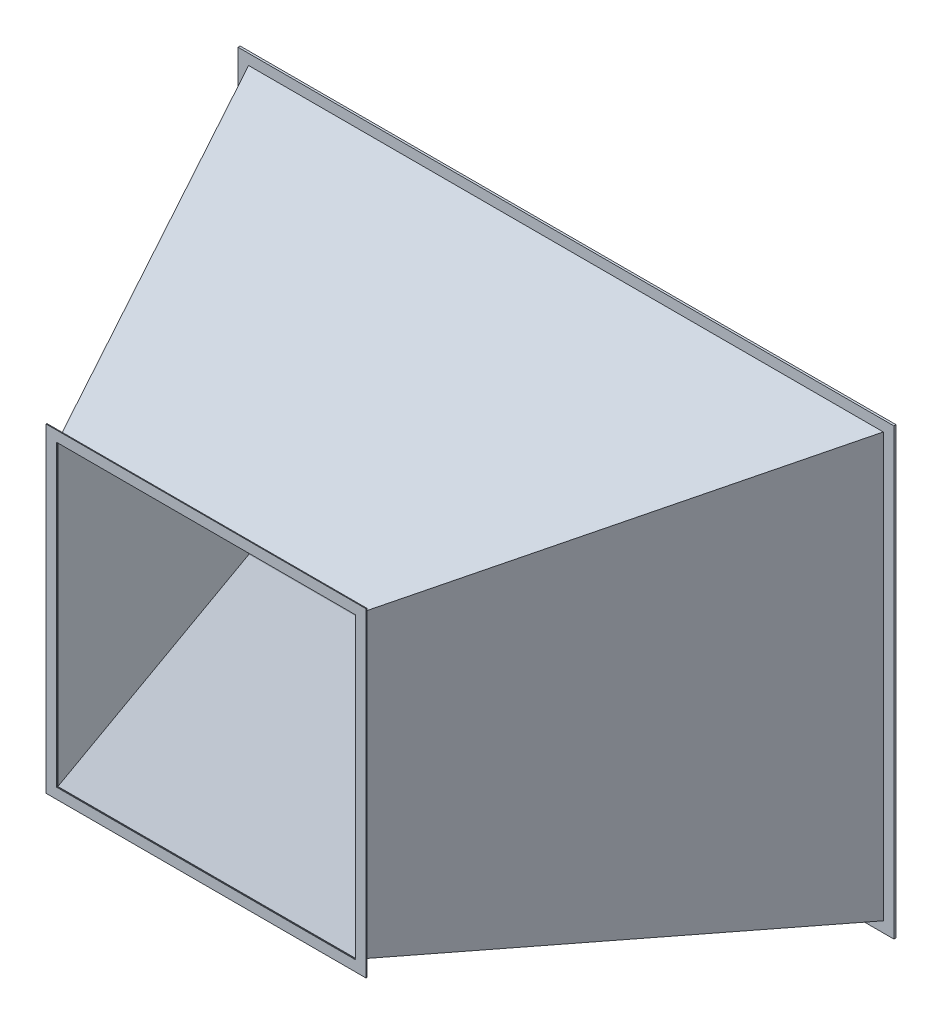
ISO-10303-21;
HEADER;
FILE_DESCRIPTION(('STEP AP214'),'2;1');
FILE_NAME('part.step','',(''),(''),'','','');
FILE_SCHEMA(('AUTOMOTIVE_DESIGN { 1 0 10303 214 1 1 1 1 }'));
ENDSEC;
DATA;
#1=APPLICATION_CONTEXT('core data for automotive mechanical design processes');
#2=APPLICATION_PROTOCOL_DEFINITION('international standard','automotive_design',2000,#1);
#3=PRODUCT_CONTEXT('',#1,'mechanical');
#4=PRODUCT('Part','Part','',(#3));
#5=PRODUCT_RELATED_PRODUCT_CATEGORY('part','',(#4));
#6=PRODUCT_DEFINITION_FORMATION('','',#4);
#7=PRODUCT_DEFINITION_CONTEXT('part definition',#1,'design');
#8=PRODUCT_DEFINITION('design','',#6,#7);
#9=PRODUCT_DEFINITION_SHAPE('','',#8);
#10=(LENGTH_UNIT() NAMED_UNIT(*) SI_UNIT(.MILLI.,.METRE.));
#11=(NAMED_UNIT(*) PLANE_ANGLE_UNIT() SI_UNIT($,.RADIAN.));
#12=(NAMED_UNIT(*) SI_UNIT($,.STERADIAN.) SOLID_ANGLE_UNIT());
#13=UNCERTAINTY_MEASURE_WITH_UNIT(LENGTH_MEASURE(1.E-05),#10,'distance_accuracy_value','');
#14=(GEOMETRIC_REPRESENTATION_CONTEXT(3) GLOBAL_UNCERTAINTY_ASSIGNED_CONTEXT((#13)) GLOBAL_UNIT_ASSIGNED_CONTEXT((#10,
#11,#12)) REPRESENTATION_CONTEXT('',''));
#15=CARTESIAN_POINT('',(0.,0.,0.));
#16=DIRECTION('',(0.,0.,1.));
#17=DIRECTION('',(1.,0.,0.));
#18=AXIS2_PLACEMENT_3D('',#15,#16,#17);
#19=CARTESIAN_POINT('',(0.,0.,-10.));
#20=DIRECTION('',(0.,0.,-1.));
#21=DIRECTION('',(-1.,0.,0.));
#22=AXIS2_PLACEMENT_3D('',#19,#20,#21);
#23=PLANE('',#22);
#24=DIRECTION('',(0.,1.,0.));
#25=VECTOR('',#24,1.);
#26=CARTESIAN_POINT('',(-1552.20788928312,0.,-10.));
#27=LINE('',#26,#25);
#28=CARTESIAN_POINT('',(-1552.20788928312,-1052.02988911692,-10.));
#29=VERTEX_POINT('',#28);
#30=CARTESIAN_POINT('',(-1552.20788928312,1052.02988911692,-10.));
#31=VERTEX_POINT('',#30);
#32=EDGE_CURVE('E202',#29,#31,#27,.T.);
#33=ORIENTED_EDGE('',*,*,#32,.T.);
#34=DIRECTION('',(1.,0.,0.));
#35=VECTOR('',#34,1.);
#36=CARTESIAN_POINT('',(0.,1052.02988911692,-10.));
#37=LINE('',#36,#35);
#38=CARTESIAN_POINT('',(1552.20788928312,1052.02988911692,-10.));
#39=VERTEX_POINT('',#38);
#40=EDGE_CURVE('E205',#31,#39,#37,.T.);
#41=ORIENTED_EDGE('',*,*,#40,.T.);
#42=DIRECTION('',(0.,-1.,0.));
#43=VECTOR('',#42,1.);
#44=CARTESIAN_POINT('',(1552.20788928312,0.,-10.));
#45=LINE('',#44,#43);
#46=CARTESIAN_POINT('',(1552.20788928312,-1052.02988911692,-10.));
#47=VERTEX_POINT('',#46);
#48=EDGE_CURVE('E208',#39,#47,#45,.T.);
#49=ORIENTED_EDGE('',*,*,#48,.T.);
#50=DIRECTION('',(-1.,0.,0.));
#51=VECTOR('',#50,1.);
#52=CARTESIAN_POINT('',(0.,-1052.02988911692,-10.));
#53=LINE('',#52,#51);
#54=EDGE_CURVE('E210',#47,#29,#53,.T.);
#55=ORIENTED_EDGE('',*,*,#54,.T.);
#56=EDGE_LOOP('',(#33,#41,#49,#55));
#57=FACE_BOUND('',#56,.T.);
#58=DIRECTION('',(1.,0.,0.));
#59=VECTOR('',#58,1.);
#60=CARTESIAN_POINT('',(1502.20788928312,1002.02988911692,-10.));
#61=LINE('',#60,#59);
#62=CARTESIAN_POINT('',(-1502.20788928312,1002.02988911692,-10.));
#63=VERTEX_POINT('',#62);
#64=CARTESIAN_POINT('',(1502.20788928312,1002.02988911692,-10.));
#65=VERTEX_POINT('',#64);
#66=EDGE_CURVE('E174',#63,#65,#61,.T.);
#67=ORIENTED_EDGE('',*,*,#66,.F.);
#68=DIRECTION('',(0.,1.,0.));
#69=VECTOR('',#68,1.);
#70=CARTESIAN_POINT('',(-1502.20788928312,-1002.02988911692,-10.));
#71=LINE('',#70,#69);
#72=CARTESIAN_POINT('',(-1502.20788928312,-1002.02988911692,-10.));
#73=VERTEX_POINT('',#72);
#74=EDGE_CURVE('E166',#73,#63,#71,.T.);
#75=ORIENTED_EDGE('',*,*,#74,.F.);
#76=DIRECTION('',(-1.,0.,0.));
#77=VECTOR('',#76,1.);
#78=CARTESIAN_POINT('',(1502.20788928312,-1002.02988911692,-10.));
#79=LINE('',#78,#77);
#80=CARTESIAN_POINT('',(1502.20788928312,-1002.02988911692,-10.));
#81=VERTEX_POINT('',#80);
#82=EDGE_CURVE('E188',#81,#73,#79,.T.);
#83=ORIENTED_EDGE('',*,*,#82,.F.);
#84=DIRECTION('',(0.,-1.,0.));
#85=VECTOR('',#84,1.);
#86=CARTESIAN_POINT('',(1502.20788928312,-1002.02988911692,-10.));
#87=LINE('',#86,#85);
#88=EDGE_CURVE('E186',#65,#81,#87,.T.);
#89=ORIENTED_EDGE('',*,*,#88,.F.);
#90=EDGE_LOOP('',(#67,#75,#83,#89));
#91=FACE_BOUND('',#90,.T.);
#92=ADVANCED_FACE('F101',(#57,#91),#23,.T.);
#93=CARTESIAN_POINT('',(0.,0.,0.));
#94=DIRECTION('',(0.,0.,-1.));
#95=DIRECTION('',(-1.,0.,0.));
#96=AXIS2_PLACEMENT_3D('',#93,#94,#95);
#97=PLANE('',#96);
#98=DIRECTION('',(0.,1.,0.));
#99=VECTOR('',#98,1.);
#100=CARTESIAN_POINT('',(-1552.20788928312,0.,0.));
#101=LINE('',#100,#99);
#102=CARTESIAN_POINT('',(-1552.20788928312,-1052.02988911692,0.));
#103=VERTEX_POINT('',#102);
#104=CARTESIAN_POINT('',(-1552.20788928312,1052.02988911692,0.));
#105=VERTEX_POINT('',#104);
#106=EDGE_CURVE('E182',#103,#105,#101,.T.);
#107=ORIENTED_EDGE('',*,*,#106,.F.);
#108=DIRECTION('',(-1.,0.,0.));
#109=VECTOR('',#108,1.);
#110=CARTESIAN_POINT('',(0.,-1052.02988911692,0.));
#111=LINE('',#110,#109);
#112=CARTESIAN_POINT('',(1552.20788928312,-1052.02988911692,0.));
#113=VERTEX_POINT('',#112);
#114=EDGE_CURVE('E206',#113,#103,#111,.T.);
#115=ORIENTED_EDGE('',*,*,#114,.F.);
#116=DIRECTION('',(0.,-1.,0.));
#117=VECTOR('',#116,1.);
#118=CARTESIAN_POINT('',(1552.20788928312,0.,0.));
#119=LINE('',#118,#117);
#120=CARTESIAN_POINT('',(1552.20788928312,1052.02988911692,0.));
#121=VERTEX_POINT('',#120);
#122=EDGE_CURVE('E217',#121,#113,#119,.T.);
#123=ORIENTED_EDGE('',*,*,#122,.F.);
#124=DIRECTION('',(1.,0.,0.));
#125=VECTOR('',#124,1.);
#126=CARTESIAN_POINT('',(0.,1052.02988911692,0.));
#127=LINE('',#126,#125);
#128=EDGE_CURVE('E215',#105,#121,#127,.T.);
#129=ORIENTED_EDGE('',*,*,#128,.F.);
#130=EDGE_LOOP('',(#107,#115,#123,#129));
#131=FACE_BOUND('',#130,.T.);
#132=DIRECTION('',(0.,1.,0.));
#133=VECTOR('',#132,1.);
#134=CARTESIAN_POINT('',(-1502.20788928312,-1002.02988911692,0.));
#135=LINE('',#134,#133);
#136=CARTESIAN_POINT('',(-1502.20788928312,-1002.02988911692,0.));
#137=VERTEX_POINT('',#136);
#138=CARTESIAN_POINT('',(-1502.20788928312,1002.02988911692,0.));
#139=VERTEX_POINT('',#138);
#140=EDGE_CURVE('E124',#137,#139,#135,.T.);
#141=ORIENTED_EDGE('',*,*,#140,.T.);
#142=DIRECTION('',(1.,0.,0.));
#143=VECTOR('',#142,1.);
#144=CARTESIAN_POINT('',(1502.20788928312,1002.02988911692,0.));
#145=LINE('',#144,#143);
#146=CARTESIAN_POINT('',(1502.20788928312,1002.02988911692,0.));
#147=VERTEX_POINT('',#146);
#148=EDGE_CURVE('E181',#139,#147,#145,.T.);
#149=ORIENTED_EDGE('',*,*,#148,.T.);
#150=DIRECTION('',(0.,-1.,0.));
#151=VECTOR('',#150,1.);
#152=CARTESIAN_POINT('',(1502.20788928312,-1002.02988911692,0.));
#153=LINE('',#152,#151);
#154=CARTESIAN_POINT('',(1502.20788928312,-1002.02988911692,0.));
#155=VERTEX_POINT('',#154);
#156=EDGE_CURVE('E194',#147,#155,#153,.T.);
#157=ORIENTED_EDGE('',*,*,#156,.T.);
#158=DIRECTION('',(-1.,0.,0.));
#159=VECTOR('',#158,1.);
#160=CARTESIAN_POINT('',(1502.20788928312,-1002.02988911692,0.));
#161=LINE('',#160,#159);
#162=EDGE_CURVE('E175',#155,#137,#161,.T.);
#163=ORIENTED_EDGE('',*,*,#162,.T.);
#164=EDGE_LOOP('',(#141,#149,#157,#163));
#165=FACE_BOUND('',#164,.T.);
#166=ADVANCED_FACE('F235',(#131,#165),#97,.F.);
#167=CARTESIAN_POINT('',(-1552.20788928312,0.,-10.));
#168=DIRECTION('',(1.,0.,0.));
#169=DIRECTION('',(0.,0.,-1.));
#170=AXIS2_PLACEMENT_3D('',#167,#168,#169);
#171=PLANE('',#170);
#172=ORIENTED_EDGE('',*,*,#106,.T.);
#173=DIRECTION('',(0.,0.,1.));
#174=VECTOR('',#173,1.);
#175=CARTESIAN_POINT('',(-1552.20788928312,1052.02988911692,-10.));
#176=LINE('',#175,#174);
#177=EDGE_CURVE('E13',#31,#105,#176,.T.);
#178=ORIENTED_EDGE('',*,*,#177,.F.);
#179=ORIENTED_EDGE('',*,*,#32,.F.);
#180=DIRECTION('',(0.,0.,1.));
#181=VECTOR('',#180,1.);
#182=CARTESIAN_POINT('',(-1552.20788928312,-1052.02988911692,-10.));
#183=LINE('',#182,#181);
#184=EDGE_CURVE('E212',#29,#103,#183,.T.);
#185=ORIENTED_EDGE('',*,*,#184,.T.);
#186=EDGE_LOOP('',(#172,#178,#179,#185));
#187=FACE_BOUND('',#186,.T.);
#188=ADVANCED_FACE('F103',(#187),#171,.F.);
#189=CARTESIAN_POINT('',(0.,1052.02988911692,-10.));
#190=DIRECTION('',(0.,-1.,0.));
#191=DIRECTION('',(0.,0.,-1.));
#192=AXIS2_PLACEMENT_3D('',#189,#190,#191);
#193=PLANE('',#192);
#194=ORIENTED_EDGE('',*,*,#128,.T.);
#195=DIRECTION('',(0.,0.,1.));
#196=VECTOR('',#195,1.);
#197=CARTESIAN_POINT('',(1552.20788928312,1052.02988911692,-10.));
#198=LINE('',#197,#196);
#199=EDGE_CURVE('E109',#39,#121,#198,.T.);
#200=ORIENTED_EDGE('',*,*,#199,.F.);
#201=ORIENTED_EDGE('',*,*,#40,.F.);
#202=ORIENTED_EDGE('',*,*,#177,.T.);
#203=EDGE_LOOP('',(#194,#200,#201,#202));
#204=FACE_BOUND('',#203,.T.);
#205=ADVANCED_FACE('F245',(#204),#193,.F.);
#206=CARTESIAN_POINT('',(1552.20788928312,0.,-10.));
#207=DIRECTION('',(-1.,0.,0.));
#208=DIRECTION('',(0.,0.,1.));
#209=AXIS2_PLACEMENT_3D('',#206,#207,#208);
#210=PLANE('',#209);
#211=ORIENTED_EDGE('',*,*,#122,.T.);
#212=DIRECTION('',(0.,0.,1.));
#213=VECTOR('',#212,1.);
#214=CARTESIAN_POINT('',(1552.20788928312,-1052.02988911692,-10.));
#215=LINE('',#214,#213);
#216=EDGE_CURVE('E222',#47,#113,#215,.T.);
#217=ORIENTED_EDGE('',*,*,#216,.F.);
#218=ORIENTED_EDGE('',*,*,#48,.F.);
#219=ORIENTED_EDGE('',*,*,#199,.T.);
#220=EDGE_LOOP('',(#211,#217,#218,#219));
#221=FACE_BOUND('',#220,.T.);
#222=ADVANCED_FACE('F229',(#221),#210,.F.);
#223=CARTESIAN_POINT('',(0.,-1052.02988911692,-10.));
#224=DIRECTION('',(0.,1.,0.));
#225=DIRECTION('',(0.,0.,1.));
#226=AXIS2_PLACEMENT_3D('',#223,#224,#225);
#227=PLANE('',#226);
#228=ORIENTED_EDGE('',*,*,#114,.T.);
#229=ORIENTED_EDGE('',*,*,#184,.F.);
#230=ORIENTED_EDGE('',*,*,#54,.F.);
#231=ORIENTED_EDGE('',*,*,#216,.T.);
#232=EDGE_LOOP('',(#228,#229,#230,#231));
#233=FACE_BOUND('',#232,.T.);
#234=ADVANCED_FACE('F239',(#233),#227,.F.);
#235=CARTESIAN_POINT('',(-1502.20788928312,-1002.02988911692,-10.));
#236=DIRECTION('',(1.,0.,0.));
#237=DIRECTION('',(0.,0.,-1.));
#238=AXIS2_PLACEMENT_3D('',#235,#236,#237);
#239=PLANE('',#238);
#240=ORIENTED_EDGE('',*,*,#140,.F.);
#241=DIRECTION('',(0.,0.,1.));
#242=VECTOR('',#241,1.);
#243=CARTESIAN_POINT('',(-1502.20788928312,-1002.02988911692,-10.));
#244=LINE('',#243,#242);
#245=EDGE_CURVE('E170',#73,#137,#244,.T.);
#246=ORIENTED_EDGE('',*,*,#245,.F.);
#247=ORIENTED_EDGE('',*,*,#74,.T.);
#248=DIRECTION('',(0.,0.,1.));
#249=VECTOR('',#248,1.);
#250=CARTESIAN_POINT('',(-1502.20788928312,1002.02988911692,-10.));
#251=LINE('',#250,#249);
#252=EDGE_CURVE('E169',#63,#139,#251,.T.);
#253=ORIENTED_EDGE('',*,*,#252,.T.);
#254=EDGE_LOOP('',(#240,#246,#247,#253));
#255=FACE_BOUND('',#254,.T.);
#256=ADVANCED_FACE('F168',(#255),#239,.T.);
#257=CARTESIAN_POINT('',(1502.20788928312,1002.02988911692,-10.));
#258=DIRECTION('',(0.,-1.,0.));
#259=DIRECTION('',(0.,0.,-1.));
#260=AXIS2_PLACEMENT_3D('',#257,#258,#259);
#261=PLANE('',#260);
#262=ORIENTED_EDGE('',*,*,#148,.F.);
#263=ORIENTED_EDGE('',*,*,#252,.F.);
#264=ORIENTED_EDGE('',*,*,#66,.T.);
#265=DIRECTION('',(0.,0.,1.));
#266=VECTOR('',#265,1.);
#267=CARTESIAN_POINT('',(1502.20788928312,1002.02988911692,-10.));
#268=LINE('',#267,#266);
#269=EDGE_CURVE('E183',#65,#147,#268,.T.);
#270=ORIENTED_EDGE('',*,*,#269,.T.);
#271=EDGE_LOOP('',(#262,#263,#264,#270));
#272=FACE_BOUND('',#271,.T.);
#273=ADVANCED_FACE('F178',(#272),#261,.T.);
#274=CARTESIAN_POINT('',(1502.20788928312,-1002.02988911692,-10.));
#275=DIRECTION('',(-1.,0.,0.));
#276=DIRECTION('',(0.,0.,1.));
#277=AXIS2_PLACEMENT_3D('',#274,#275,#276);
#278=PLANE('',#277);
#279=ORIENTED_EDGE('',*,*,#156,.F.);
#280=ORIENTED_EDGE('',*,*,#269,.F.);
#281=ORIENTED_EDGE('',*,*,#88,.T.);
#282=DIRECTION('',(0.,0.,1.));
#283=VECTOR('',#282,1.);
#284=CARTESIAN_POINT('',(1502.20788928312,-1002.02988911692,-10.));
#285=LINE('',#284,#283);
#286=EDGE_CURVE('E116',#81,#155,#285,.T.);
#287=ORIENTED_EDGE('',*,*,#286,.T.);
#288=EDGE_LOOP('',(#279,#280,#281,#287));
#289=FACE_BOUND('',#288,.T.);
#290=ADVANCED_FACE('F268',(#289),#278,.T.);
#291=CARTESIAN_POINT('',(1502.20788928312,-1002.02988911692,-10.));
#292=DIRECTION('',(0.,1.,0.));
#293=DIRECTION('',(0.,0.,1.));
#294=AXIS2_PLACEMENT_3D('',#291,#292,#293);
#295=PLANE('',#294);
#296=ORIENTED_EDGE('',*,*,#162,.F.);
#297=ORIENTED_EDGE('',*,*,#286,.F.);
#298=ORIENTED_EDGE('',*,*,#82,.T.);
#299=ORIENTED_EDGE('',*,*,#245,.T.);
#300=EDGE_LOOP('',(#296,#297,#298,#299));
#301=FACE_BOUND('',#300,.T.);
#302=ADVANCED_FACE('F272',(#301),#295,.T.);
#303=CLOSED_SHELL('',(#92,#166,#188,#205,#222,#234,#256,#273,#290,#302));
#304=MANIFOLD_SOLID_BREP('B2',#303);
#305=CARTESIAN_POINT('',(0.,0.,1704.));
#306=DIRECTION('',(0.,0.,1.));
#307=DIRECTION('',(1.,0.,0.));
#308=AXIS2_PLACEMENT_3D('',#305,#306,#307);
#309=PLANE('',#308);
#310=DIRECTION('',(0.,1.,0.));
#311=VECTOR('',#310,1.);
#312=CARTESIAN_POINT('',(757.207889283118,0.,1704.));
#313=LINE('',#312,#311);
#314=CARTESIAN_POINT('',(757.207889283118,-757.02988911692,1704.));
#315=VERTEX_POINT('',#314);
#316=CARTESIAN_POINT('',(757.207889283118,757.02988911692,1704.));
#317=VERTEX_POINT('',#316);
#318=EDGE_CURVE('E440',#315,#317,#313,.T.);
#319=ORIENTED_EDGE('',*,*,#318,.T.);
#320=DIRECTION('',(-1.,0.,0.));
#321=VECTOR('',#320,1.);
#322=CARTESIAN_POINT('',(0.,757.02988911692,1704.));
#323=LINE('',#322,#321);
#324=CARTESIAN_POINT('',(-757.207889283118,757.02988911692,1704.));
#325=VERTEX_POINT('',#324);
#326=EDGE_CURVE('E443',#317,#325,#323,.T.);
#327=ORIENTED_EDGE('',*,*,#326,.T.);
#328=DIRECTION('',(0.,-1.,0.));
#329=VECTOR('',#328,1.);
#330=CARTESIAN_POINT('',(-757.207889283118,0.,1704.));
#331=LINE('',#330,#329);
#332=CARTESIAN_POINT('',(-757.207889283118,-757.02988911692,1704.));
#333=VERTEX_POINT('',#332);
#334=EDGE_CURVE('E446',#325,#333,#331,.T.);
#335=ORIENTED_EDGE('',*,*,#334,.T.);
#336=DIRECTION('',(1.,0.,0.));
#337=VECTOR('',#336,1.);
#338=CARTESIAN_POINT('',(0.,-757.02988911692,1704.));
#339=LINE('',#338,#337);
#340=EDGE_CURVE('E448',#333,#315,#339,.T.);
#341=ORIENTED_EDGE('',*,*,#340,.T.);
#342=EDGE_LOOP('',(#319,#327,#335,#341));
#343=FACE_BOUND('',#342,.T.);
#344=DIRECTION('',(-1.,0.,0.));
#345=VECTOR('',#344,1.);
#346=CARTESIAN_POINT('',(-707.207889283118,707.02988911692,1704.));
#347=LINE('',#346,#345);
#348=CARTESIAN_POINT('',(707.207889283118,707.02988911692,1704.));
#349=VERTEX_POINT('',#348);
#350=CARTESIAN_POINT('',(-707.207889283118,707.02988911692,1704.));
#351=VERTEX_POINT('',#350);
#352=EDGE_CURVE('E412',#349,#351,#347,.T.);
#353=ORIENTED_EDGE('',*,*,#352,.F.);
#354=DIRECTION('',(0.,1.,0.));
#355=VECTOR('',#354,1.);
#356=CARTESIAN_POINT('',(707.207889283118,-707.02988911692,1704.));
#357=LINE('',#356,#355);
#358=CARTESIAN_POINT('',(707.207889283118,-707.02988911692,1704.));
#359=VERTEX_POINT('',#358);
#360=EDGE_CURVE('E404',#359,#349,#357,.T.);
#361=ORIENTED_EDGE('',*,*,#360,.F.);
#362=DIRECTION('',(1.,0.,0.));
#363=VECTOR('',#362,1.);
#364=CARTESIAN_POINT('',(-707.207889283118,-707.02988911692,1704.));
#365=LINE('',#364,#363);
#366=CARTESIAN_POINT('',(-707.207889283118,-707.02988911692,1704.));
#367=VERTEX_POINT('',#366);
#368=EDGE_CURVE('E426',#367,#359,#365,.T.);
#369=ORIENTED_EDGE('',*,*,#368,.F.);
#370=DIRECTION('',(0.,-1.,0.));
#371=VECTOR('',#370,1.);
#372=CARTESIAN_POINT('',(-707.207889283118,-707.02988911692,1704.));
#373=LINE('',#372,#371);
#374=EDGE_CURVE('E424',#351,#367,#373,.T.);
#375=ORIENTED_EDGE('',*,*,#374,.F.);
#376=EDGE_LOOP('',(#353,#361,#369,#375));
#377=FACE_BOUND('',#376,.T.);
#378=ADVANCED_FACE('F339',(#343,#377),#309,.T.);
#379=CARTESIAN_POINT('',(0.,0.,1700.));
#380=DIRECTION('',(0.,0.,1.));
#381=DIRECTION('',(1.,0.,0.));
#382=AXIS2_PLACEMENT_3D('',#379,#380,#381);
#383=PLANE('',#382);
#384=DIRECTION('',(0.,1.,0.));
#385=VECTOR('',#384,1.);
#386=CARTESIAN_POINT('',(757.207889283118,0.,1700.));
#387=LINE('',#386,#385);
#388=CARTESIAN_POINT('',(757.207889283118,-757.02988911692,1700.));
#389=VERTEX_POINT('',#388);
#390=CARTESIAN_POINT('',(757.207889283118,757.02988911692,1700.));
#391=VERTEX_POINT('',#390);
#392=EDGE_CURVE('E420',#389,#391,#387,.T.);
#393=ORIENTED_EDGE('',*,*,#392,.F.);
#394=DIRECTION('',(1.,0.,0.));
#395=VECTOR('',#394,1.);
#396=CARTESIAN_POINT('',(0.,-757.02988911692,1700.));
#397=LINE('',#396,#395);
#398=CARTESIAN_POINT('',(-757.207889283118,-757.02988911692,1700.));
#399=VERTEX_POINT('',#398);
#400=EDGE_CURVE('E444',#399,#389,#397,.T.);
#401=ORIENTED_EDGE('',*,*,#400,.F.);
#402=DIRECTION('',(0.,-1.,0.));
#403=VECTOR('',#402,1.);
#404=CARTESIAN_POINT('',(-757.207889283118,0.,1700.));
#405=LINE('',#404,#403);
#406=CARTESIAN_POINT('',(-757.207889283118,757.02988911692,1700.));
#407=VERTEX_POINT('',#406);
#408=EDGE_CURVE('E455',#407,#399,#405,.T.);
#409=ORIENTED_EDGE('',*,*,#408,.F.);
#410=DIRECTION('',(-1.,0.,0.));
#411=VECTOR('',#410,1.);
#412=CARTESIAN_POINT('',(0.,757.02988911692,1700.));
#413=LINE('',#412,#411);
#414=EDGE_CURVE('E453',#391,#407,#413,.T.);
#415=ORIENTED_EDGE('',*,*,#414,.F.);
#416=EDGE_LOOP('',(#393,#401,#409,#415));
#417=FACE_BOUND('',#416,.T.);
#418=DIRECTION('',(0.,1.,0.));
#419=VECTOR('',#418,1.);
#420=CARTESIAN_POINT('',(707.207889283118,-707.02988911692,1700.));
#421=LINE('',#420,#419);
#422=CARTESIAN_POINT('',(707.207889283118,-707.02988911692,1700.));
#423=VERTEX_POINT('',#422);
#424=CARTESIAN_POINT('',(707.207889283118,707.02988911692,1700.));
#425=VERTEX_POINT('',#424);
#426=EDGE_CURVE('E362',#423,#425,#421,.T.);
#427=ORIENTED_EDGE('',*,*,#426,.T.);
#428=DIRECTION('',(-1.,0.,0.));
#429=VECTOR('',#428,1.);
#430=CARTESIAN_POINT('',(-707.207889283118,707.02988911692,1700.));
#431=LINE('',#430,#429);
#432=CARTESIAN_POINT('',(-707.207889283118,707.02988911692,1700.));
#433=VERTEX_POINT('',#432);
#434=EDGE_CURVE('E419',#425,#433,#431,.T.);
#435=ORIENTED_EDGE('',*,*,#434,.T.);
#436=DIRECTION('',(0.,-1.,0.));
#437=VECTOR('',#436,1.);
#438=CARTESIAN_POINT('',(-707.207889283118,-707.02988911692,1700.));
#439=LINE('',#438,#437);
#440=CARTESIAN_POINT('',(-707.207889283118,-707.02988911692,1700.));
#441=VERTEX_POINT('',#440);
#442=EDGE_CURVE('E432',#433,#441,#439,.T.);
#443=ORIENTED_EDGE('',*,*,#442,.T.);
#444=DIRECTION('',(1.,0.,0.));
#445=VECTOR('',#444,1.);
#446=CARTESIAN_POINT('',(-707.207889283118,-707.02988911692,1700.));
#447=LINE('',#446,#445);
#448=EDGE_CURVE('E413',#441,#423,#447,.T.);
#449=ORIENTED_EDGE('',*,*,#448,.T.);
#450=EDGE_LOOP('',(#427,#435,#443,#449));
#451=FACE_BOUND('',#450,.T.);
#452=ADVANCED_FACE('F473',(#417,#451),#383,.F.);
#453=CARTESIAN_POINT('',(757.207889283118,0.,1704.));
#454=DIRECTION('',(-1.,0.,0.));
#455=DIRECTION('',(0.,0.,1.));
#456=AXIS2_PLACEMENT_3D('',#453,#454,#455);
#457=PLANE('',#456);
#458=ORIENTED_EDGE('',*,*,#392,.T.);
#459=DIRECTION('',(0.,0.,-1.));
#460=VECTOR('',#459,1.);
#461=CARTESIAN_POINT('',(757.207889283118,757.02988911692,1704.));
#462=LINE('',#461,#460);
#463=EDGE_CURVE('E99',#317,#391,#462,.T.);
#464=ORIENTED_EDGE('',*,*,#463,.F.);
#465=ORIENTED_EDGE('',*,*,#318,.F.);
#466=DIRECTION('',(0.,0.,-1.));
#467=VECTOR('',#466,1.);
#468=CARTESIAN_POINT('',(757.207889283118,-757.02988911692,1704.));
#469=LINE('',#468,#467);
#470=EDGE_CURVE('E450',#315,#389,#469,.T.);
#471=ORIENTED_EDGE('',*,*,#470,.T.);
#472=EDGE_LOOP('',(#458,#464,#465,#471));
#473=FACE_BOUND('',#472,.T.);
#474=ADVANCED_FACE('F341',(#473),#457,.F.);
#475=CARTESIAN_POINT('',(0.,757.02988911692,1704.));
#476=DIRECTION('',(0.,-1.,0.));
#477=DIRECTION('',(0.,0.,-1.));
#478=AXIS2_PLACEMENT_3D('',#475,#476,#477);
#479=PLANE('',#478);
#480=ORIENTED_EDGE('',*,*,#414,.T.);
#481=DIRECTION('',(0.,0.,-1.));
#482=VECTOR('',#481,1.);
#483=CARTESIAN_POINT('',(-757.207889283118,757.02988911692,1704.));
#484=LINE('',#483,#482);
#485=EDGE_CURVE('E347',#325,#407,#484,.T.);
#486=ORIENTED_EDGE('',*,*,#485,.F.);
#487=ORIENTED_EDGE('',*,*,#326,.F.);
#488=ORIENTED_EDGE('',*,*,#463,.T.);
#489=EDGE_LOOP('',(#480,#486,#487,#488));
#490=FACE_BOUND('',#489,.T.);
#491=ADVANCED_FACE('F483',(#490),#479,.F.);
#492=CARTESIAN_POINT('',(-757.207889283118,0.,1704.));
#493=DIRECTION('',(1.,0.,0.));
#494=DIRECTION('',(0.,0.,-1.));
#495=AXIS2_PLACEMENT_3D('',#492,#493,#494);
#496=PLANE('',#495);
#497=ORIENTED_EDGE('',*,*,#408,.T.);
#498=DIRECTION('',(0.,0.,-1.));
#499=VECTOR('',#498,1.);
#500=CARTESIAN_POINT('',(-757.207889283118,-757.02988911692,1704.));
#501=LINE('',#500,#499);
#502=EDGE_CURVE('E460',#333,#399,#501,.T.);
#503=ORIENTED_EDGE('',*,*,#502,.F.);
#504=ORIENTED_EDGE('',*,*,#334,.F.);
#505=ORIENTED_EDGE('',*,*,#485,.T.);
#506=EDGE_LOOP('',(#497,#503,#504,#505));
#507=FACE_BOUND('',#506,.T.);
#508=ADVANCED_FACE('F467',(#507),#496,.F.);
#509=CARTESIAN_POINT('',(0.,-757.02988911692,1704.));
#510=DIRECTION('',(0.,1.,0.));
#511=DIRECTION('',(0.,0.,1.));
#512=AXIS2_PLACEMENT_3D('',#509,#510,#511);
#513=PLANE('',#512);
#514=ORIENTED_EDGE('',*,*,#400,.T.);
#515=ORIENTED_EDGE('',*,*,#470,.F.);
#516=ORIENTED_EDGE('',*,*,#340,.F.);
#517=ORIENTED_EDGE('',*,*,#502,.T.);
#518=EDGE_LOOP('',(#514,#515,#516,#517));
#519=FACE_BOUND('',#518,.T.);
#520=ADVANCED_FACE('F477',(#519),#513,.F.);
#521=CARTESIAN_POINT('',(707.207889283118,-707.02988911692,1704.));
#522=DIRECTION('',(-1.,0.,0.));
#523=DIRECTION('',(0.,0.,1.));
#524=AXIS2_PLACEMENT_3D('',#521,#522,#523);
#525=PLANE('',#524);
#526=ORIENTED_EDGE('',*,*,#426,.F.);
#527=DIRECTION('',(0.,0.,-1.));
#528=VECTOR('',#527,1.);
#529=CARTESIAN_POINT('',(707.207889283118,-707.02988911692,1704.));
#530=LINE('',#529,#528);
#531=EDGE_CURVE('E408',#359,#423,#530,.T.);
#532=ORIENTED_EDGE('',*,*,#531,.F.);
#533=ORIENTED_EDGE('',*,*,#360,.T.);
#534=DIRECTION('',(0.,0.,-1.));
#535=VECTOR('',#534,1.);
#536=CARTESIAN_POINT('',(707.207889283118,707.02988911692,1704.));
#537=LINE('',#536,#535);
#538=EDGE_CURVE('E407',#349,#425,#537,.T.);
#539=ORIENTED_EDGE('',*,*,#538,.T.);
#540=EDGE_LOOP('',(#526,#532,#533,#539));
#541=FACE_BOUND('',#540,.T.);
#542=ADVANCED_FACE('F406',(#541),#525,.T.);
#543=CARTESIAN_POINT('',(-707.207889283118,707.02988911692,1704.));
#544=DIRECTION('',(0.,-1.,0.));
#545=DIRECTION('',(0.,0.,-1.));
#546=AXIS2_PLACEMENT_3D('',#543,#544,#545);
#547=PLANE('',#546);
#548=ORIENTED_EDGE('',*,*,#434,.F.);
#549=ORIENTED_EDGE('',*,*,#538,.F.);
#550=ORIENTED_EDGE('',*,*,#352,.T.);
#551=DIRECTION('',(0.,0.,-1.));
#552=VECTOR('',#551,1.);
#553=CARTESIAN_POINT('',(-707.207889283118,707.02988911692,1704.));
#554=LINE('',#553,#552);
#555=EDGE_CURVE('E421',#351,#433,#554,.T.);
#556=ORIENTED_EDGE('',*,*,#555,.T.);
#557=EDGE_LOOP('',(#548,#549,#550,#556));
#558=FACE_BOUND('',#557,.T.);
#559=ADVANCED_FACE('F416',(#558),#547,.T.);
#560=CARTESIAN_POINT('',(-707.207889283118,-707.02988911692,1704.));
#561=DIRECTION('',(1.,0.,0.));
#562=DIRECTION('',(0.,0.,-1.));
#563=AXIS2_PLACEMENT_3D('',#560,#561,#562);
#564=PLANE('',#563);
#565=ORIENTED_EDGE('',*,*,#442,.F.);
#566=ORIENTED_EDGE('',*,*,#555,.F.);
#567=ORIENTED_EDGE('',*,*,#374,.T.);
#568=DIRECTION('',(0.,0.,-1.));
#569=VECTOR('',#568,1.);
#570=CARTESIAN_POINT('',(-707.207889283118,-707.02988911692,1704.));
#571=LINE('',#570,#569);
#572=EDGE_CURVE('E354',#367,#441,#571,.T.);
#573=ORIENTED_EDGE('',*,*,#572,.T.);
#574=EDGE_LOOP('',(#565,#566,#567,#573));
#575=FACE_BOUND('',#574,.T.);
#576=ADVANCED_FACE('F506',(#575),#564,.T.);
#577=CARTESIAN_POINT('',(-707.207889283118,-707.02988911692,1704.));
#578=DIRECTION('',(0.,1.,0.));
#579=DIRECTION('',(0.,0.,1.));
#580=AXIS2_PLACEMENT_3D('',#577,#578,#579);
#581=PLANE('',#580);
#582=ORIENTED_EDGE('',*,*,#448,.F.);
#583=ORIENTED_EDGE('',*,*,#572,.F.);
#584=ORIENTED_EDGE('',*,*,#368,.T.);
#585=ORIENTED_EDGE('',*,*,#531,.T.);
#586=EDGE_LOOP('',(#582,#583,#584,#585));
#587=FACE_BOUND('',#586,.T.);
#588=ADVANCED_FACE('F510',(#587),#581,.T.);
#589=CLOSED_SHELL('',(#378,#452,#474,#491,#508,#520,#542,#559,#576,#588));
#590=MANIFOLD_SOLID_BREP('B7',#589);
#591=CARTESIAN_POINT('',(0.,0.,1700.));
#592=DIRECTION('',(0.,0.,-1.));
#593=DIRECTION('',(-1.,0.,0.));
#594=AXIS2_PLACEMENT_3D('',#591,#592,#593);
#595=PLANE('',#594);
#596=DIRECTION('',(0.,1.,0.));
#597=VECTOR('',#596,1.);
#598=CARTESIAN_POINT('',(707.207889283118,0.,1700.));
#599=LINE('',#598,#597);
#600=CARTESIAN_POINT('',(707.207889283118,-707.02988911692,1700.));
#601=VERTEX_POINT('',#600);
#602=CARTESIAN_POINT('',(707.207889283118,707.02988911692,1700.));
#603=VERTEX_POINT('',#602);
#604=EDGE_CURVE('E726',#601,#603,#599,.T.);
#605=ORIENTED_EDGE('',*,*,#604,.T.);
#606=DIRECTION('',(-1.,0.,0.));
#607=VECTOR('',#606,1.);
#608=CARTESIAN_POINT('',(0.,707.02988911692,1700.));
#609=LINE('',#608,#607);
#610=CARTESIAN_POINT('',(-707.207889283118,707.02988911692,1700.));
#611=VERTEX_POINT('',#610);
#612=EDGE_CURVE('E730',#603,#611,#609,.T.);
#613=ORIENTED_EDGE('',*,*,#612,.T.);
#614=DIRECTION('',(0.,-1.,0.));
#615=VECTOR('',#614,1.);
#616=CARTESIAN_POINT('',(-707.207889283117,0.,1700.));
#617=LINE('',#616,#615);
#618=CARTESIAN_POINT('',(-707.207889283118,-707.02988911692,1700.));
#619=VERTEX_POINT('',#618);
#620=EDGE_CURVE('E578',#611,#619,#617,.T.);
#621=ORIENTED_EDGE('',*,*,#620,.T.);
#622=DIRECTION('',(1.,0.,0.));
#623=VECTOR('',#622,1.);
#624=CARTESIAN_POINT('',(0.,-707.02988911692,1700.));
#625=LINE('',#624,#623);
#626=EDGE_CURVE('E337',#619,#601,#625,.T.);
#627=ORIENTED_EDGE('',*,*,#626,.T.);
#628=EDGE_LOOP('',(#605,#613,#621,#627));
#629=FACE_BOUND('',#628,.T.);
#630=DIRECTION('',(0.,1.,0.));
#631=VECTOR('',#630,1.);
#632=CARTESIAN_POINT('',(705.,-705.,1700.));
#633=LINE('',#632,#631);
#634=CARTESIAN_POINT('',(705.,-705.,1700.));
#635=VERTEX_POINT('',#634);
#636=CARTESIAN_POINT('',(705.,705.,1700.));
#637=VERTEX_POINT('',#636);
#638=EDGE_CURVE('E652',#635,#637,#633,.T.);
#639=ORIENTED_EDGE('',*,*,#638,.F.);
#640=DIRECTION('',(1.,0.,0.));
#641=VECTOR('',#640,1.);
#642=CARTESIAN_POINT('',(-705.,-705.,1700.));
#643=LINE('',#642,#641);
#644=CARTESIAN_POINT('',(-705.,-705.,1700.));
#645=VERTEX_POINT('',#644);
#646=EDGE_CURVE('E704',#645,#635,#643,.T.);
#647=ORIENTED_EDGE('',*,*,#646,.F.);
#648=DIRECTION('',(0.,-1.,0.));
#649=VECTOR('',#648,1.);
#650=CARTESIAN_POINT('',(-705.,-705.,1700.));
#651=LINE('',#650,#649);
#652=CARTESIAN_POINT('',(-705.,705.,1700.));
#653=VERTEX_POINT('',#652);
#654=EDGE_CURVE('E572',#653,#645,#651,.T.);
#655=ORIENTED_EDGE('',*,*,#654,.F.);
#656=DIRECTION('',(-1.,0.,0.));
#657=VECTOR('',#656,1.);
#658=CARTESIAN_POINT('',(-705.,705.,1700.));
#659=LINE('',#658,#657);
#660=EDGE_CURVE('E705',#637,#653,#659,.T.);
#661=ORIENTED_EDGE('',*,*,#660,.F.);
#662=EDGE_LOOP('',(#639,#647,#655,#661));
#663=FACE_BOUND('',#662,.T.);
#664=ADVANCED_FACE('F568',(#629,#663),#595,.F.);
#665=CARTESIAN_POINT('',(0.,0.,0.));
#666=DIRECTION('',(0.,0.,-1.));
#667=DIRECTION('',(-1.,0.,0.));
#668=AXIS2_PLACEMENT_3D('',#665,#666,#667);
#669=PLANE('',#668);
#670=DIRECTION('',(0.,1.,0.));
#671=VECTOR('',#670,1.);
#672=CARTESIAN_POINT('',(1500.,-1000.,0.));
#673=LINE('',#672,#671);
#674=CARTESIAN_POINT('',(1500.,-1000.,0.));
#675=VERTEX_POINT('',#674);
#676=CARTESIAN_POINT('',(1500.,1000.,0.));
#677=VERTEX_POINT('',#676);
#678=EDGE_CURVE('E643',#675,#677,#673,.T.);
#679=ORIENTED_EDGE('',*,*,#678,.T.);
#680=DIRECTION('',(-1.,0.,0.));
#681=VECTOR('',#680,1.);
#682=CARTESIAN_POINT('',(-1500.,1000.,0.));
#683=LINE('',#682,#681);
#684=CARTESIAN_POINT('',(-1500.,1000.,0.));
#685=VERTEX_POINT('',#684);
#686=EDGE_CURVE('E634',#677,#685,#683,.T.);
#687=ORIENTED_EDGE('',*,*,#686,.T.);
#688=DIRECTION('',(0.,-1.,0.));
#689=VECTOR('',#688,1.);
#690=CARTESIAN_POINT('',(-1500.,-1000.,0.));
#691=LINE('',#690,#689);
#692=CARTESIAN_POINT('',(-1500.,-1000.,0.));
#693=VERTEX_POINT('',#692);
#694=EDGE_CURVE('E642',#685,#693,#691,.T.);
#695=ORIENTED_EDGE('',*,*,#694,.T.);
#696=DIRECTION('',(1.,0.,0.));
#697=VECTOR('',#696,1.);
#698=CARTESIAN_POINT('',(-1500.,-1000.,0.));
#699=LINE('',#698,#697);
#700=EDGE_CURVE('E660',#693,#675,#699,.T.);
#701=ORIENTED_EDGE('',*,*,#700,.T.);
#702=EDGE_LOOP('',(#679,#687,#695,#701));
#703=FACE_BOUND('',#702,.T.);
#704=DIRECTION('',(0.,1.,0.));
#705=VECTOR('',#704,1.);
#706=CARTESIAN_POINT('',(1502.20788928312,0.,0.));
#707=LINE('',#706,#705);
#708=CARTESIAN_POINT('',(1502.20788928312,-1002.02988911692,0.));
#709=VERTEX_POINT('',#708);
#710=CARTESIAN_POINT('',(1502.20788928312,1002.02988911692,0.));
#711=VERTEX_POINT('',#710);
#712=EDGE_CURVE('E742',#709,#711,#707,.T.);
#713=ORIENTED_EDGE('',*,*,#712,.F.);
#714=DIRECTION('',(1.,0.,0.));
#715=VECTOR('',#714,1.);
#716=CARTESIAN_POINT('',(0.,-1002.02988911692,0.));
#717=LINE('',#716,#715);
#718=CARTESIAN_POINT('',(-1502.20788928312,-1002.02988911692,0.));
#719=VERTEX_POINT('',#718);
#720=EDGE_CURVE('E719',#719,#709,#717,.T.);
#721=ORIENTED_EDGE('',*,*,#720,.F.);
#722=DIRECTION('',(0.,-1.,0.));
#723=VECTOR('',#722,1.);
#724=CARTESIAN_POINT('',(-1502.20788928312,0.,0.));
#725=LINE('',#724,#723);
#726=CARTESIAN_POINT('',(-1502.20788928312,1002.02988911692,0.));
#727=VERTEX_POINT('',#726);
#728=EDGE_CURVE('E736',#727,#719,#725,.T.);
#729=ORIENTED_EDGE('',*,*,#728,.F.);
#730=DIRECTION('',(-1.,0.,0.));
#731=VECTOR('',#730,1.);
#732=CARTESIAN_POINT('',(0.,1002.02988911692,0.));
#733=LINE('',#732,#731);
#734=EDGE_CURVE('E739',#711,#727,#733,.T.);
#735=ORIENTED_EDGE('',*,*,#734,.F.);
#736=EDGE_LOOP('',(#713,#721,#729,#735));
#737=FACE_BOUND('',#736,.T.);
#738=ADVANCED_FACE('F658',(#703,#737),#669,.T.);
#739=CARTESIAN_POINT('',(-1232.6377013304,0.,576.439395622159));
#740=DIRECTION('',(0.905842523578003,0.,-0.423614591908537));
#741=DIRECTION('',(-0.423614591908537,0.,-0.905842523578003));
#742=AXIS2_PLACEMENT_3D('',#739,#740,#741);
#743=PLANE('',#742);
#744=DIRECTION('',(0.418476118901822,0.155283591290613,0.89485459387811));
#745=VECTOR('',#744,1.);
#746=CARTESIAN_POINT('',(-1174.02346375027,-880.250762661337,701.778016862684));
#747=LINE('',#746,#745);
#748=EDGE_CURVE('E716',#719,#619,#747,.T.);
#749=ORIENTED_EDGE('',*,*,#748,.T.);
#750=ORIENTED_EDGE('',*,*,#620,.F.);
#751=DIRECTION('',(0.418476118901822,-0.155283591290613,0.89485459387811));
#752=VECTOR('',#751,1.);
#753=CARTESIAN_POINT('',(-1174.02346375027,880.250762661336,701.778016862684));
#754=LINE('',#753,#752);
#755=EDGE_CURVE('E718',#727,#611,#754,.T.);
#756=ORIENTED_EDGE('',*,*,#755,.F.);
#757=ORIENTED_EDGE('',*,*,#728,.T.);
#758=EDGE_LOOP('',(#749,#750,#756,#757));
#759=FACE_BOUND('',#758,.T.);
#760=ADVANCED_FACE('F681',(#759),#743,.F.);
#761=CARTESIAN_POINT('',(0.,972.7383476954,168.798713276555));
#762=DIRECTION('',(0.,-0.985275492798741,-0.170974276691546));
#763=DIRECTION('',(0.,0.170974276691546,-0.985275492798741));
#764=AXIS2_PLACEMENT_3D('',#761,#762,#763);
#765=PLANE('',#764);
#766=ORIENTED_EDGE('',*,*,#755,.T.);
#767=ORIENTED_EDGE('',*,*,#612,.F.);
#768=DIRECTION('',(-0.418476118901822,-0.155283591290613,0.89485459387811));
#769=VECTOR('',#768,1.);
#770=CARTESIAN_POINT('',(1174.02346375027,880.250762661336,701.778016862684));
#771=LINE('',#770,#769);
#772=EDGE_CURVE('E723',#711,#603,#771,.T.);
#773=ORIENTED_EDGE('',*,*,#772,.F.);
#774=ORIENTED_EDGE('',*,*,#734,.T.);
#775=EDGE_LOOP('',(#766,#767,#773,#774));
#776=FACE_BOUND('',#775,.T.);
#777=ADVANCED_FACE('F830',(#776),#765,.F.);
#778=CARTESIAN_POINT('',(0.,-972.7383476954,168.798713276555));
#779=DIRECTION('',(0.,0.985275492798741,-0.170974276691546));
#780=DIRECTION('',(0.,0.170974276691546,0.985275492798741));
#781=AXIS2_PLACEMENT_3D('',#778,#779,#780);
#782=PLANE('',#781);
#783=DIRECTION('',(-0.418476118901822,0.155283591290613,0.89485459387811));
#784=VECTOR('',#783,1.);
#785=CARTESIAN_POINT('',(1174.02346375027,-880.250762661337,701.778016862684));
#786=LINE('',#785,#784);
#787=EDGE_CURVE('E722',#709,#601,#786,.T.);
#788=ORIENTED_EDGE('',*,*,#787,.T.);
#789=ORIENTED_EDGE('',*,*,#626,.F.);
#790=ORIENTED_EDGE('',*,*,#748,.F.);
#791=ORIENTED_EDGE('',*,*,#720,.T.);
#792=EDGE_LOOP('',(#788,#789,#790,#791));
#793=FACE_BOUND('',#792,.T.);
#794=ADVANCED_FACE('F823',(#793),#782,.F.);
#795=CARTESIAN_POINT('',(1232.6377013304,0.,576.439395622159));
#796=DIRECTION('',(-0.905842523578003,0.,-0.423614591908537));
#797=DIRECTION('',(-0.423614591908537,0.,0.905842523578003));
#798=AXIS2_PLACEMENT_3D('',#795,#796,#797);
#799=PLANE('',#798);
#800=ORIENTED_EDGE('',*,*,#772,.T.);
#801=ORIENTED_EDGE('',*,*,#604,.F.);
#802=ORIENTED_EDGE('',*,*,#787,.F.);
#803=ORIENTED_EDGE('',*,*,#712,.T.);
#804=EDGE_LOOP('',(#800,#801,#802,#803));
#805=FACE_BOUND('',#804,.T.);
#806=ADVANCED_FACE('F570',(#805),#799,.F.);
#807=CARTESIAN_POINT('',(-1230.82601628325,0.,575.592166438342));
#808=DIRECTION('',(0.905842523578003,0.,-0.423614591908537));
#809=DIRECTION('',(-0.423614591908537,0.,-0.905842523578003));
#810=AXIS2_PLACEMENT_3D('',#807,#808,#809);
#811=PLANE('',#810);
#812=DIRECTION('',(0.418476118901822,0.155283591290613,0.89485459387811));
#813=VECTOR('',#812,1.);
#814=CARTESIAN_POINT('',(-1500.,-1000.,0.));
#815=LINE('',#814,#813);
#816=EDGE_CURVE('E748',#693,#645,#815,.T.);
#817=ORIENTED_EDGE('',*,*,#816,.F.);
#818=ORIENTED_EDGE('',*,*,#694,.F.);
#819=DIRECTION('',(0.418476118901822,-0.155283591290613,0.89485459387811));
#820=VECTOR('',#819,1.);
#821=CARTESIAN_POINT('',(-1500.,1000.,0.));
#822=LINE('',#821,#820);
#823=EDGE_CURVE('E593',#685,#653,#822,.T.);
#824=ORIENTED_EDGE('',*,*,#823,.T.);
#825=ORIENTED_EDGE('',*,*,#654,.T.);
#826=EDGE_LOOP('',(#817,#818,#824,#825));
#827=FACE_BOUND('',#826,.T.);
#828=ADVANCED_FACE('F760',(#827),#811,.T.);
#829=CARTESIAN_POINT('',(0.,970.767796709803,168.456764723172));
#830=DIRECTION('',(0.,-0.985275492798741,-0.170974276691546));
#831=DIRECTION('',(0.,0.170974276691546,-0.985275492798741));
#832=AXIS2_PLACEMENT_3D('',#829,#830,#831);
#833=PLANE('',#832);
#834=ORIENTED_EDGE('',*,*,#823,.F.);
#835=ORIENTED_EDGE('',*,*,#686,.F.);
#836=DIRECTION('',(-0.418476118901822,-0.155283591290613,0.89485459387811));
#837=VECTOR('',#836,1.);
#838=CARTESIAN_POINT('',(1500.,1000.,0.));
#839=LINE('',#838,#837);
#840=EDGE_CURVE('E637',#677,#637,#839,.T.);
#841=ORIENTED_EDGE('',*,*,#840,.T.);
#842=ORIENTED_EDGE('',*,*,#660,.T.);
#843=EDGE_LOOP('',(#834,#835,#841,#842));
#844=FACE_BOUND('',#843,.T.);
#845=ADVANCED_FACE('F636',(#844),#833,.T.);
#846=CARTESIAN_POINT('',(0.,-970.767796709803,168.456764723172));
#847=DIRECTION('',(0.,0.985275492798741,-0.170974276691546));
#848=DIRECTION('',(0.,0.170974276691546,0.985275492798741));
#849=AXIS2_PLACEMENT_3D('',#846,#847,#848);
#850=PLANE('',#849);
#851=DIRECTION('',(-0.418476118901822,0.155283591290613,0.89485459387811));
#852=VECTOR('',#851,1.);
#853=CARTESIAN_POINT('',(1500.,-1000.,0.));
#854=LINE('',#853,#852);
#855=EDGE_CURVE('E655',#675,#635,#854,.T.);
#856=ORIENTED_EDGE('',*,*,#855,.F.);
#857=ORIENTED_EDGE('',*,*,#700,.F.);
#858=ORIENTED_EDGE('',*,*,#816,.T.);
#859=ORIENTED_EDGE('',*,*,#646,.T.);
#860=EDGE_LOOP('',(#856,#857,#858,#859));
#861=FACE_BOUND('',#860,.T.);
#862=ADVANCED_FACE('F805',(#861),#850,.T.);
#863=CARTESIAN_POINT('',(1230.82601628325,0.,575.592166438342));
#864=DIRECTION('',(-0.905842523578003,0.,-0.423614591908537));
#865=DIRECTION('',(-0.423614591908537,0.,0.905842523578003));
#866=AXIS2_PLACEMENT_3D('',#863,#864,#865);
#867=PLANE('',#866);
#868=ORIENTED_EDGE('',*,*,#840,.F.);
#869=ORIENTED_EDGE('',*,*,#678,.F.);
#870=ORIENTED_EDGE('',*,*,#855,.T.);
#871=ORIENTED_EDGE('',*,*,#638,.T.);
#872=EDGE_LOOP('',(#868,#869,#870,#871));
#873=FACE_BOUND('',#872,.T.);
#874=ADVANCED_FACE('F647',(#873),#867,.T.);
#875=CLOSED_SHELL('',(#664,#738,#760,#777,#794,#806,#828,#845,#862,#874));
#876=MANIFOLD_SOLID_BREP('B93',#875);
#877=ADVANCED_BREP_SHAPE_REPRESENTATION('',(#18,#304,#590,#876),#14);
#878=SHAPE_DEFINITION_REPRESENTATION(#9,#877);
ENDSEC;
END-ISO-10303-21;
